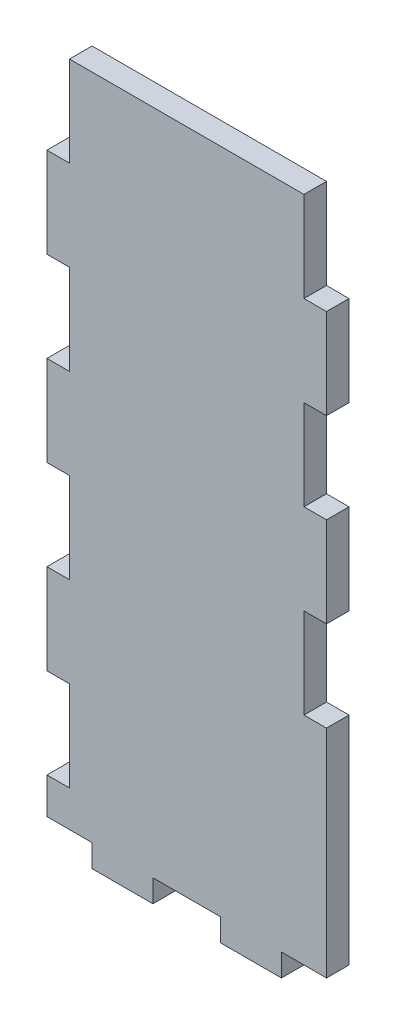
ISO-10303-21;
HEADER;
FILE_DESCRIPTION(('STEP AP214'),'2;1');
FILE_NAME('part.step','',(''),(''),'','','');
FILE_SCHEMA(('AUTOMOTIVE_DESIGN { 1 0 10303 214 1 1 1 1 }'));
ENDSEC;
DATA;
#1=APPLICATION_CONTEXT('core data for automotive mechanical design processes');
#2=APPLICATION_PROTOCOL_DEFINITION('international standard','automotive_design',2000,#1);
#3=PRODUCT_CONTEXT('',#1,'mechanical');
#4=PRODUCT('Part','Part','',(#3));
#5=PRODUCT_RELATED_PRODUCT_CATEGORY('part','',(#4));
#6=PRODUCT_DEFINITION_FORMATION('','',#4);
#7=PRODUCT_DEFINITION_CONTEXT('part definition',#1,'design');
#8=PRODUCT_DEFINITION('design','',#6,#7);
#9=PRODUCT_DEFINITION_SHAPE('','',#8);
#10=(LENGTH_UNIT() NAMED_UNIT(*) SI_UNIT(.MILLI.,.METRE.));
#11=(NAMED_UNIT(*) PLANE_ANGLE_UNIT() SI_UNIT($,.RADIAN.));
#12=(NAMED_UNIT(*) SI_UNIT($,.STERADIAN.) SOLID_ANGLE_UNIT());
#13=UNCERTAINTY_MEASURE_WITH_UNIT(LENGTH_MEASURE(1.E-05),#10,'distance_accuracy_value','');
#14=(GEOMETRIC_REPRESENTATION_CONTEXT(3) GLOBAL_UNCERTAINTY_ASSIGNED_CONTEXT((#13)) GLOBAL_UNIT_ASSIGNED_CONTEXT((#10,
#11,#12)) REPRESENTATION_CONTEXT('',''));
#15=CARTESIAN_POINT('',(0.,0.,0.));
#16=DIRECTION('',(0.,0.,1.));
#17=DIRECTION('',(1.,0.,0.));
#18=AXIS2_PLACEMENT_3D('',#15,#16,#17);
#19=CARTESIAN_POINT('',(33.0200000000001,0.,6.35));
#20=DIRECTION('',(1.,0.,0.));
#21=DIRECTION('',(0.,0.,-1.));
#22=AXIS2_PLACEMENT_3D('',#19,#20,#21);
#23=PLANE('',#22);
#24=DIRECTION('',(0.,-1.,0.));
#25=VECTOR('',#24,1.);
#26=CARTESIAN_POINT('',(33.0200000000001,0.,0.));
#27=LINE('',#26,#25);
#28=CARTESIAN_POINT('',(33.0200000000001,93.98,0.));
#29=VERTEX_POINT('',#28);
#30=CARTESIAN_POINT('',(33.0200000000001,68.58,0.));
#31=VERTEX_POINT('',#30);
#32=EDGE_CURVE('E316',#29,#31,#27,.T.);
#33=ORIENTED_EDGE('',*,*,#32,.F.);
#34=DIRECTION('',(0.,0.,-1.));
#35=VECTOR('',#34,1.);
#36=CARTESIAN_POINT('',(33.0200000000001,93.98,6.35));
#37=LINE('',#36,#35);
#38=CARTESIAN_POINT('',(33.0200000000001,93.98,6.35));
#39=VERTEX_POINT('',#38);
#40=EDGE_CURVE('E11',#39,#29,#37,.T.);
#41=ORIENTED_EDGE('',*,*,#40,.F.);
#42=DIRECTION('',(0.,-1.,0.));
#43=VECTOR('',#42,1.);
#44=CARTESIAN_POINT('',(33.0200000000001,0.,6.35));
#45=LINE('',#44,#43);
#46=CARTESIAN_POINT('',(33.0200000000001,68.58,6.35));
#47=VERTEX_POINT('',#46);
#48=EDGE_CURVE('E425',#39,#47,#45,.T.);
#49=ORIENTED_EDGE('',*,*,#48,.T.);
#50=DIRECTION('',(0.,0.,-1.));
#51=VECTOR('',#50,1.);
#52=CARTESIAN_POINT('',(33.0200000000001,68.58,6.35));
#53=LINE('',#52,#51);
#54=EDGE_CURVE('E67',#47,#31,#53,.T.);
#55=ORIENTED_EDGE('',*,*,#54,.T.);
#56=EDGE_LOOP('',(#33,#41,#49,#55));
#57=FACE_BOUND('',#56,.T.);
#58=ADVANCED_FACE('F49',(#57),#23,.T.);
#59=CARTESIAN_POINT('',(0.,93.98,6.35));
#60=DIRECTION('',(0.,1.,0.));
#61=DIRECTION('',(0.,0.,1.));
#62=AXIS2_PLACEMENT_3D('',#59,#60,#61);
#63=PLANE('',#62);
#64=DIRECTION('',(1.,0.,0.));
#65=VECTOR('',#64,1.);
#66=CARTESIAN_POINT('',(0.,93.98,0.));
#67=LINE('',#66,#65);
#68=CARTESIAN_POINT('',(-33.02,93.98,0.));
#69=VERTEX_POINT('',#68);
#70=EDGE_CURVE('E319',#69,#29,#67,.T.);
#71=ORIENTED_EDGE('',*,*,#70,.F.);
#72=DIRECTION('',(0.,0.,-1.));
#73=VECTOR('',#72,1.);
#74=CARTESIAN_POINT('',(-33.02,93.98,6.35));
#75=LINE('',#74,#73);
#76=CARTESIAN_POINT('',(-33.02,93.98,6.35));
#77=VERTEX_POINT('',#76);
#78=EDGE_CURVE('E59',#77,#69,#75,.T.);
#79=ORIENTED_EDGE('',*,*,#78,.F.);
#80=DIRECTION('',(1.,0.,0.));
#81=VECTOR('',#80,1.);
#82=CARTESIAN_POINT('',(0.,93.98,6.35));
#83=LINE('',#82,#81);
#84=EDGE_CURVE('E547',#77,#39,#83,.T.);
#85=ORIENTED_EDGE('',*,*,#84,.T.);
#86=ORIENTED_EDGE('',*,*,#40,.T.);
#87=EDGE_LOOP('',(#71,#79,#85,#86));
#88=FACE_BOUND('',#87,.T.);
#89=ADVANCED_FACE('F51',(#88),#63,.T.);
#90=CARTESIAN_POINT('',(-33.02,0.,6.35));
#91=DIRECTION('',(1.,0.,0.));
#92=DIRECTION('',(0.,0.,-1.));
#93=AXIS2_PLACEMENT_3D('',#90,#91,#92);
#94=PLANE('',#93);
#95=DIRECTION('',(0.,-1.,0.));
#96=VECTOR('',#95,1.);
#97=CARTESIAN_POINT('',(-33.02,0.,0.));
#98=LINE('',#97,#96);
#99=CARTESIAN_POINT('',(-33.02,68.58,0.));
#100=VERTEX_POINT('',#99);
#101=EDGE_CURVE('E325',#69,#100,#98,.T.);
#102=ORIENTED_EDGE('',*,*,#101,.T.);
#103=DIRECTION('',(0.,0.,-1.));
#104=VECTOR('',#103,1.);
#105=CARTESIAN_POINT('',(-33.02,68.58,6.35));
#106=LINE('',#105,#104);
#107=CARTESIAN_POINT('',(-33.02,68.58,6.35));
#108=VERTEX_POINT('',#107);
#109=EDGE_CURVE('E530',#108,#100,#106,.T.);
#110=ORIENTED_EDGE('',*,*,#109,.F.);
#111=DIRECTION('',(0.,-1.,0.));
#112=VECTOR('',#111,1.);
#113=CARTESIAN_POINT('',(-33.02,0.,6.35));
#114=LINE('',#113,#112);
#115=EDGE_CURVE('E538',#77,#108,#114,.T.);
#116=ORIENTED_EDGE('',*,*,#115,.F.);
#117=ORIENTED_EDGE('',*,*,#78,.T.);
#118=EDGE_LOOP('',(#102,#110,#116,#117));
#119=FACE_BOUND('',#118,.T.);
#120=ADVANCED_FACE('F536',(#119),#94,.F.);
#121=CARTESIAN_POINT('',(0.,68.58,6.35));
#122=DIRECTION('',(0.,1.,0.));
#123=DIRECTION('',(0.,0.,1.));
#124=AXIS2_PLACEMENT_3D('',#121,#122,#123);
#125=PLANE('',#124);
#126=DIRECTION('',(1.,0.,0.));
#127=VECTOR('',#126,1.);
#128=CARTESIAN_POINT('',(0.,68.58,0.));
#129=LINE('',#128,#127);
#130=CARTESIAN_POINT('',(-39.37,68.58,0.));
#131=VERTEX_POINT('',#130);
#132=EDGE_CURVE('E329',#131,#100,#129,.T.);
#133=ORIENTED_EDGE('',*,*,#132,.F.);
#134=DIRECTION('',(0.,0.,-1.));
#135=VECTOR('',#134,1.);
#136=CARTESIAN_POINT('',(-39.37,68.58,6.35));
#137=LINE('',#136,#135);
#138=CARTESIAN_POINT('',(-39.37,68.58,6.35));
#139=VERTEX_POINT('',#138);
#140=EDGE_CURVE('E527',#139,#131,#137,.T.);
#141=ORIENTED_EDGE('',*,*,#140,.F.);
#142=DIRECTION('',(1.,0.,0.));
#143=VECTOR('',#142,1.);
#144=CARTESIAN_POINT('',(0.,68.58,6.35));
#145=LINE('',#144,#143);
#146=EDGE_CURVE('E732',#139,#108,#145,.T.);
#147=ORIENTED_EDGE('',*,*,#146,.T.);
#148=ORIENTED_EDGE('',*,*,#109,.T.);
#149=EDGE_LOOP('',(#133,#141,#147,#148));
#150=FACE_BOUND('',#149,.T.);
#151=ADVANCED_FACE('F747',(#150),#125,.T.);
#152=CARTESIAN_POINT('',(-39.37,0.,6.35));
#153=DIRECTION('',(1.,0.,0.));
#154=DIRECTION('',(0.,0.,-1.));
#155=AXIS2_PLACEMENT_3D('',#152,#153,#154);
#156=PLANE('',#155);
#157=DIRECTION('',(0.,-1.,0.));
#158=VECTOR('',#157,1.);
#159=CARTESIAN_POINT('',(-39.37,0.,0.));
#160=LINE('',#159,#158);
#161=CARTESIAN_POINT('',(-39.37,43.18,0.));
#162=VERTEX_POINT('',#161);
#163=EDGE_CURVE('E335',#131,#162,#160,.T.);
#164=ORIENTED_EDGE('',*,*,#163,.T.);
#165=DIRECTION('',(0.,0.,-1.));
#166=VECTOR('',#165,1.);
#167=CARTESIAN_POINT('',(-39.37,43.18,6.35));
#168=LINE('',#167,#166);
#169=CARTESIAN_POINT('',(-39.37,43.18,6.35));
#170=VERTEX_POINT('',#169);
#171=EDGE_CURVE('E523',#170,#162,#168,.T.);
#172=ORIENTED_EDGE('',*,*,#171,.F.);
#173=DIRECTION('',(0.,-1.,0.));
#174=VECTOR('',#173,1.);
#175=CARTESIAN_POINT('',(-39.37,0.,6.35));
#176=LINE('',#175,#174);
#177=EDGE_CURVE('E736',#139,#170,#176,.T.);
#178=ORIENTED_EDGE('',*,*,#177,.F.);
#179=ORIENTED_EDGE('',*,*,#140,.T.);
#180=EDGE_LOOP('',(#164,#172,#178,#179));
#181=FACE_BOUND('',#180,.T.);
#182=ADVANCED_FACE('F748',(#181),#156,.F.);
#183=CARTESIAN_POINT('',(0.,43.18,6.35));
#184=DIRECTION('',(0.,1.,0.));
#185=DIRECTION('',(0.,0.,1.));
#186=AXIS2_PLACEMENT_3D('',#183,#184,#185);
#187=PLANE('',#186);
#188=DIRECTION('',(1.,0.,0.));
#189=VECTOR('',#188,1.);
#190=CARTESIAN_POINT('',(0.,43.18,0.));
#191=LINE('',#190,#189);
#192=CARTESIAN_POINT('',(-33.02,43.18,0.));
#193=VERTEX_POINT('',#192);
#194=EDGE_CURVE('E338',#162,#193,#191,.T.);
#195=ORIENTED_EDGE('',*,*,#194,.T.);
#196=DIRECTION('',(0.,0.,-1.));
#197=VECTOR('',#196,1.);
#198=CARTESIAN_POINT('',(-33.02,43.18,6.35));
#199=LINE('',#198,#197);
#200=CARTESIAN_POINT('',(-33.02,43.18,6.35));
#201=VERTEX_POINT('',#200);
#202=EDGE_CURVE('E519',#201,#193,#199,.T.);
#203=ORIENTED_EDGE('',*,*,#202,.F.);
#204=DIRECTION('',(1.,0.,0.));
#205=VECTOR('',#204,1.);
#206=CARTESIAN_POINT('',(0.,43.18,6.35));
#207=LINE('',#206,#205);
#208=EDGE_CURVE('E664',#170,#201,#207,.T.);
#209=ORIENTED_EDGE('',*,*,#208,.F.);
#210=ORIENTED_EDGE('',*,*,#171,.T.);
#211=EDGE_LOOP('',(#195,#203,#209,#210));
#212=FACE_BOUND('',#211,.T.);
#213=ADVANCED_FACE('F744',(#212),#187,.F.);
#214=CARTESIAN_POINT('',(-33.02,17.78,0.));
#215=VERTEX_POINT('',#214);
#216=EDGE_CURVE('E331',#193,#215,#98,.T.);
#217=ORIENTED_EDGE('',*,*,#216,.T.);
#218=DIRECTION('',(0.,0.,-1.));
#219=VECTOR('',#218,1.);
#220=CARTESIAN_POINT('',(-33.02,17.78,6.35));
#221=LINE('',#220,#219);
#222=CARTESIAN_POINT('',(-33.02,17.78,6.35));
#223=VERTEX_POINT('',#222);
#224=EDGE_CURVE('E516',#223,#215,#221,.T.);
#225=ORIENTED_EDGE('',*,*,#224,.F.);
#226=EDGE_CURVE('E658',#201,#223,#114,.T.);
#227=ORIENTED_EDGE('',*,*,#226,.F.);
#228=ORIENTED_EDGE('',*,*,#202,.T.);
#229=EDGE_LOOP('',(#217,#225,#227,#228));
#230=FACE_BOUND('',#229,.T.);
#231=ADVANCED_FACE('F643',(#230),#94,.F.);
#232=CARTESIAN_POINT('',(0.,17.78,6.35));
#233=DIRECTION('',(0.,1.,0.));
#234=DIRECTION('',(0.,0.,1.));
#235=AXIS2_PLACEMENT_3D('',#232,#233,#234);
#236=PLANE('',#235);
#237=DIRECTION('',(1.,0.,0.));
#238=VECTOR('',#237,1.);
#239=CARTESIAN_POINT('',(0.,17.78,0.));
#240=LINE('',#239,#238);
#241=CARTESIAN_POINT('',(-39.37,17.78,0.));
#242=VERTEX_POINT('',#241);
#243=EDGE_CURVE('E341',#242,#215,#240,.T.);
#244=ORIENTED_EDGE('',*,*,#243,.F.);
#245=DIRECTION('',(0.,0.,-1.));
#246=VECTOR('',#245,1.);
#247=CARTESIAN_POINT('',(-39.37,17.78,6.35));
#248=LINE('',#247,#246);
#249=CARTESIAN_POINT('',(-39.37,17.78,6.35));
#250=VERTEX_POINT('',#249);
#251=EDGE_CURVE('E513',#250,#242,#248,.T.);
#252=ORIENTED_EDGE('',*,*,#251,.F.);
#253=DIRECTION('',(1.,0.,0.));
#254=VECTOR('',#253,1.);
#255=CARTESIAN_POINT('',(0.,17.78,6.35));
#256=LINE('',#255,#254);
#257=EDGE_CURVE('E655',#250,#223,#256,.T.);
#258=ORIENTED_EDGE('',*,*,#257,.T.);
#259=ORIENTED_EDGE('',*,*,#224,.T.);
#260=EDGE_LOOP('',(#244,#252,#258,#259));
#261=FACE_BOUND('',#260,.T.);
#262=ADVANCED_FACE('F652',(#261),#236,.T.);
#263=CARTESIAN_POINT('',(-39.37,0.,6.35));
#264=DIRECTION('',(1.,0.,0.));
#265=DIRECTION('',(0.,0.,-1.));
#266=AXIS2_PLACEMENT_3D('',#263,#264,#265);
#267=PLANE('',#266);
#268=DIRECTION('',(0.,-1.,0.));
#269=VECTOR('',#268,1.);
#270=CARTESIAN_POINT('',(-39.37,0.,0.));
#271=LINE('',#270,#269);
#272=CARTESIAN_POINT('',(-39.37,-7.61999999999999,0.));
#273=VERTEX_POINT('',#272);
#274=EDGE_CURVE('E345',#242,#273,#271,.T.);
#275=ORIENTED_EDGE('',*,*,#274,.T.);
#276=DIRECTION('',(0.,0.,-1.));
#277=VECTOR('',#276,1.);
#278=CARTESIAN_POINT('',(-39.37,-7.61999999999999,6.35));
#279=LINE('',#278,#277);
#280=CARTESIAN_POINT('',(-39.37,-7.61999999999999,6.35));
#281=VERTEX_POINT('',#280);
#282=EDGE_CURVE('E509',#281,#273,#279,.T.);
#283=ORIENTED_EDGE('',*,*,#282,.F.);
#284=DIRECTION('',(0.,-1.,0.));
#285=VECTOR('',#284,1.);
#286=CARTESIAN_POINT('',(-39.37,0.,6.35));
#287=LINE('',#286,#285);
#288=EDGE_CURVE('E657',#250,#281,#287,.T.);
#289=ORIENTED_EDGE('',*,*,#288,.F.);
#290=ORIENTED_EDGE('',*,*,#251,.T.);
#291=EDGE_LOOP('',(#275,#283,#289,#290));
#292=FACE_BOUND('',#291,.T.);
#293=ADVANCED_FACE('F759',(#292),#267,.F.);
#294=CARTESIAN_POINT('',(0.,-7.61999999999999,6.35));
#295=DIRECTION('',(0.,1.,0.));
#296=DIRECTION('',(0.,0.,1.));
#297=AXIS2_PLACEMENT_3D('',#294,#295,#296);
#298=PLANE('',#297);
#299=DIRECTION('',(1.,0.,0.));
#300=VECTOR('',#299,1.);
#301=CARTESIAN_POINT('',(0.,-7.61999999999999,0.));
#302=LINE('',#301,#300);
#303=CARTESIAN_POINT('',(-33.02,-7.61999999999999,0.));
#304=VERTEX_POINT('',#303);
#305=EDGE_CURVE('E348',#273,#304,#302,.T.);
#306=ORIENTED_EDGE('',*,*,#305,.T.);
#307=DIRECTION('',(0.,0.,-1.));
#308=VECTOR('',#307,1.);
#309=CARTESIAN_POINT('',(-33.02,-7.61999999999999,6.35));
#310=LINE('',#309,#308);
#311=CARTESIAN_POINT('',(-33.02,-7.61999999999999,6.35));
#312=VERTEX_POINT('',#311);
#313=EDGE_CURVE('E505',#312,#304,#310,.T.);
#314=ORIENTED_EDGE('',*,*,#313,.F.);
#315=DIRECTION('',(1.,0.,0.));
#316=VECTOR('',#315,1.);
#317=CARTESIAN_POINT('',(0.,-7.61999999999999,6.35));
#318=LINE('',#317,#316);
#319=EDGE_CURVE('E662',#281,#312,#318,.T.);
#320=ORIENTED_EDGE('',*,*,#319,.F.);
#321=ORIENTED_EDGE('',*,*,#282,.T.);
#322=EDGE_LOOP('',(#306,#314,#320,#321));
#323=FACE_BOUND('',#322,.T.);
#324=ADVANCED_FACE('F762',(#323),#298,.F.);
#325=CARTESIAN_POINT('',(-33.02,-33.02,0.));
#326=VERTEX_POINT('',#325);
#327=EDGE_CURVE('E351',#304,#326,#98,.T.);
#328=ORIENTED_EDGE('',*,*,#327,.T.);
#329=DIRECTION('',(0.,0.,-1.));
#330=VECTOR('',#329,1.);
#331=CARTESIAN_POINT('',(-33.02,-33.02,6.35));
#332=LINE('',#331,#330);
#333=CARTESIAN_POINT('',(-33.02,-33.02,6.35));
#334=VERTEX_POINT('',#333);
#335=EDGE_CURVE('E502',#334,#326,#332,.T.);
#336=ORIENTED_EDGE('',*,*,#335,.F.);
#337=EDGE_CURVE('E666',#312,#334,#114,.T.);
#338=ORIENTED_EDGE('',*,*,#337,.F.);
#339=ORIENTED_EDGE('',*,*,#313,.T.);
#340=EDGE_LOOP('',(#328,#336,#338,#339));
#341=FACE_BOUND('',#340,.T.);
#342=ADVANCED_FACE('F766',(#341),#94,.F.);
#343=CARTESIAN_POINT('',(0.,-33.02,6.35));
#344=DIRECTION('',(0.,1.,0.));
#345=DIRECTION('',(0.,0.,1.));
#346=AXIS2_PLACEMENT_3D('',#343,#344,#345);
#347=PLANE('',#346);
#348=DIRECTION('',(1.,0.,0.));
#349=VECTOR('',#348,1.);
#350=CARTESIAN_POINT('',(0.,-33.02,0.));
#351=LINE('',#350,#349);
#352=CARTESIAN_POINT('',(-39.37,-33.02,0.));
#353=VERTEX_POINT('',#352);
#354=EDGE_CURVE('E352',#353,#326,#351,.T.);
#355=ORIENTED_EDGE('',*,*,#354,.F.);
#356=DIRECTION('',(0.,0.,-1.));
#357=VECTOR('',#356,1.);
#358=CARTESIAN_POINT('',(-39.37,-33.02,6.35));
#359=LINE('',#358,#357);
#360=CARTESIAN_POINT('',(-39.37,-33.02,6.35));
#361=VERTEX_POINT('',#360);
#362=EDGE_CURVE('E499',#361,#353,#359,.T.);
#363=ORIENTED_EDGE('',*,*,#362,.F.);
#364=DIRECTION('',(1.,0.,0.));
#365=VECTOR('',#364,1.);
#366=CARTESIAN_POINT('',(0.,-33.02,6.35));
#367=LINE('',#366,#365);
#368=EDGE_CURVE('E672',#361,#334,#367,.T.);
#369=ORIENTED_EDGE('',*,*,#368,.T.);
#370=ORIENTED_EDGE('',*,*,#335,.T.);
#371=EDGE_LOOP('',(#355,#363,#369,#370));
#372=FACE_BOUND('',#371,.T.);
#373=ADVANCED_FACE('F768',(#372),#347,.T.);
#374=CARTESIAN_POINT('',(-39.37,0.,6.35));
#375=DIRECTION('',(1.,0.,0.));
#376=DIRECTION('',(0.,0.,-1.));
#377=AXIS2_PLACEMENT_3D('',#374,#375,#376);
#378=PLANE('',#377);
#379=DIRECTION('',(0.,-1.,0.));
#380=VECTOR('',#379,1.);
#381=CARTESIAN_POINT('',(-39.37,0.,0.));
#382=LINE('',#381,#380);
#383=CARTESIAN_POINT('',(-39.37,-58.42,0.));
#384=VERTEX_POINT('',#383);
#385=EDGE_CURVE('E356',#353,#384,#382,.T.);
#386=ORIENTED_EDGE('',*,*,#385,.T.);
#387=DIRECTION('',(0.,0.,-1.));
#388=VECTOR('',#387,1.);
#389=CARTESIAN_POINT('',(-39.37,-58.42,6.35));
#390=LINE('',#389,#388);
#391=CARTESIAN_POINT('',(-39.37,-58.42,6.35));
#392=VERTEX_POINT('',#391);
#393=EDGE_CURVE('E495',#392,#384,#390,.T.);
#394=ORIENTED_EDGE('',*,*,#393,.F.);
#395=DIRECTION('',(0.,-1.,0.));
#396=VECTOR('',#395,1.);
#397=CARTESIAN_POINT('',(-39.37,0.,6.35));
#398=LINE('',#397,#396);
#399=EDGE_CURVE('E676',#361,#392,#398,.T.);
#400=ORIENTED_EDGE('',*,*,#399,.F.);
#401=ORIENTED_EDGE('',*,*,#362,.T.);
#402=EDGE_LOOP('',(#386,#394,#400,#401));
#403=FACE_BOUND('',#402,.T.);
#404=ADVANCED_FACE('F771',(#403),#378,.F.);
#405=CARTESIAN_POINT('',(0.,-58.42,6.35));
#406=DIRECTION('',(0.,1.,0.));
#407=DIRECTION('',(0.,0.,1.));
#408=AXIS2_PLACEMENT_3D('',#405,#406,#407);
#409=PLANE('',#408);
#410=DIRECTION('',(1.,0.,0.));
#411=VECTOR('',#410,1.);
#412=CARTESIAN_POINT('',(0.,-58.42,0.));
#413=LINE('',#412,#411);
#414=CARTESIAN_POINT('',(-33.02,-58.42,0.));
#415=VERTEX_POINT('',#414);
#416=EDGE_CURVE('E359',#384,#415,#413,.T.);
#417=ORIENTED_EDGE('',*,*,#416,.T.);
#418=DIRECTION('',(0.,0.,-1.));
#419=VECTOR('',#418,1.);
#420=CARTESIAN_POINT('',(-33.02,-58.42,6.35));
#421=LINE('',#420,#419);
#422=CARTESIAN_POINT('',(-33.02,-58.42,6.35));
#423=VERTEX_POINT('',#422);
#424=EDGE_CURVE('E491',#423,#415,#421,.T.);
#425=ORIENTED_EDGE('',*,*,#424,.F.);
#426=DIRECTION('',(1.,0.,0.));
#427=VECTOR('',#426,1.);
#428=CARTESIAN_POINT('',(0.,-58.42,6.35));
#429=LINE('',#428,#427);
#430=EDGE_CURVE('E679',#392,#423,#429,.T.);
#431=ORIENTED_EDGE('',*,*,#430,.F.);
#432=ORIENTED_EDGE('',*,*,#393,.T.);
#433=EDGE_LOOP('',(#417,#425,#431,#432));
#434=FACE_BOUND('',#433,.T.);
#435=ADVANCED_FACE('F775',(#434),#409,.F.);
#436=CARTESIAN_POINT('',(-33.02,-83.82,0.));
#437=VERTEX_POINT('',#436);
#438=EDGE_CURVE('E330',#415,#437,#98,.T.);
#439=ORIENTED_EDGE('',*,*,#438,.T.);
#440=DIRECTION('',(0.,0.,-1.));
#441=VECTOR('',#440,1.);
#442=CARTESIAN_POINT('',(-33.02,-83.82,6.35));
#443=LINE('',#442,#441);
#444=CARTESIAN_POINT('',(-33.02,-83.82,6.35));
#445=VERTEX_POINT('',#444);
#446=EDGE_CURVE('E488',#445,#437,#443,.T.);
#447=ORIENTED_EDGE('',*,*,#446,.F.);
#448=EDGE_CURVE('E682',#423,#445,#114,.T.);
#449=ORIENTED_EDGE('',*,*,#448,.F.);
#450=ORIENTED_EDGE('',*,*,#424,.T.);
#451=EDGE_LOOP('',(#439,#447,#449,#450));
#452=FACE_BOUND('',#451,.T.);
#453=ADVANCED_FACE('F779',(#452),#94,.F.);
#454=CARTESIAN_POINT('',(0.,-83.82,6.35));
#455=DIRECTION('',(0.,1.,0.));
#456=DIRECTION('',(0.,0.,1.));
#457=AXIS2_PLACEMENT_3D('',#454,#455,#456);
#458=PLANE('',#457);
#459=DIRECTION('',(1.,0.,0.));
#460=VECTOR('',#459,1.);
#461=CARTESIAN_POINT('',(0.,-83.82,0.));
#462=LINE('',#461,#460);
#463=CARTESIAN_POINT('',(-39.37,-83.82,0.));
#464=VERTEX_POINT('',#463);
#465=EDGE_CURVE('E362',#464,#437,#462,.T.);
#466=ORIENTED_EDGE('',*,*,#465,.F.);
#467=DIRECTION('',(0.,0.,-1.));
#468=VECTOR('',#467,1.);
#469=CARTESIAN_POINT('',(-39.37,-83.82,6.35));
#470=LINE('',#469,#468);
#471=CARTESIAN_POINT('',(-39.37,-83.82,6.35));
#472=VERTEX_POINT('',#471);
#473=EDGE_CURVE('E485',#472,#464,#470,.T.);
#474=ORIENTED_EDGE('',*,*,#473,.F.);
#475=DIRECTION('',(1.,0.,0.));
#476=VECTOR('',#475,1.);
#477=CARTESIAN_POINT('',(0.,-83.82,6.35));
#478=LINE('',#477,#476);
#479=EDGE_CURVE('E683',#472,#445,#478,.T.);
#480=ORIENTED_EDGE('',*,*,#479,.T.);
#481=ORIENTED_EDGE('',*,*,#446,.T.);
#482=EDGE_LOOP('',(#466,#474,#480,#481));
#483=FACE_BOUND('',#482,.T.);
#484=ADVANCED_FACE('F783',(#483),#458,.T.);
#485=CARTESIAN_POINT('',(-39.37,0.,6.35));
#486=DIRECTION('',(1.,0.,0.));
#487=DIRECTION('',(0.,0.,-1.));
#488=AXIS2_PLACEMENT_3D('',#485,#486,#487);
#489=PLANE('',#488);
#490=DIRECTION('',(0.,-1.,0.));
#491=VECTOR('',#490,1.);
#492=CARTESIAN_POINT('',(-39.37,0.,0.));
#493=LINE('',#492,#491);
#494=CARTESIAN_POINT('',(-39.37,-93.98,0.));
#495=VERTEX_POINT('',#494);
#496=EDGE_CURVE('E366',#464,#495,#493,.T.);
#497=ORIENTED_EDGE('',*,*,#496,.T.);
#498=DIRECTION('',(0.,0.,-1.));
#499=VECTOR('',#498,1.);
#500=CARTESIAN_POINT('',(-39.37,-93.98,6.35));
#501=LINE('',#500,#499);
#502=CARTESIAN_POINT('',(-39.37,-93.98,6.35));
#503=VERTEX_POINT('',#502);
#504=EDGE_CURVE('E481',#503,#495,#501,.T.);
#505=ORIENTED_EDGE('',*,*,#504,.F.);
#506=DIRECTION('',(0.,-1.,0.));
#507=VECTOR('',#506,1.);
#508=CARTESIAN_POINT('',(-39.37,0.,6.35));
#509=LINE('',#508,#507);
#510=EDGE_CURVE('E687',#472,#503,#509,.T.);
#511=ORIENTED_EDGE('',*,*,#510,.F.);
#512=ORIENTED_EDGE('',*,*,#473,.T.);
#513=EDGE_LOOP('',(#497,#505,#511,#512));
#514=FACE_BOUND('',#513,.T.);
#515=ADVANCED_FACE('F787',(#514),#489,.F.);
#516=CARTESIAN_POINT('',(0.,-93.98,6.35));
#517=DIRECTION('',(0.,1.,0.));
#518=DIRECTION('',(0.,0.,1.));
#519=AXIS2_PLACEMENT_3D('',#516,#517,#518);
#520=PLANE('',#519);
#521=DIRECTION('',(1.,0.,0.));
#522=VECTOR('',#521,1.);
#523=CARTESIAN_POINT('',(0.,-93.98,0.));
#524=LINE('',#523,#522);
#525=CARTESIAN_POINT('',(-26.67,-93.98,0.));
#526=VERTEX_POINT('',#525);
#527=EDGE_CURVE('E369',#495,#526,#524,.T.);
#528=ORIENTED_EDGE('',*,*,#527,.T.);
#529=DIRECTION('',(0.,0.,-1.));
#530=VECTOR('',#529,1.);
#531=CARTESIAN_POINT('',(-26.67,-93.98,6.35));
#532=LINE('',#531,#530);
#533=CARTESIAN_POINT('',(-26.67,-93.98,6.35));
#534=VERTEX_POINT('',#533);
#535=EDGE_CURVE('E477',#534,#526,#532,.T.);
#536=ORIENTED_EDGE('',*,*,#535,.F.);
#537=DIRECTION('',(1.,0.,0.));
#538=VECTOR('',#537,1.);
#539=CARTESIAN_POINT('',(0.,-93.98,6.35));
#540=LINE('',#539,#538);
#541=EDGE_CURVE('E690',#503,#534,#540,.T.);
#542=ORIENTED_EDGE('',*,*,#541,.F.);
#543=ORIENTED_EDGE('',*,*,#504,.T.);
#544=EDGE_LOOP('',(#528,#536,#542,#543));
#545=FACE_BOUND('',#544,.T.);
#546=ADVANCED_FACE('F791',(#545),#520,.F.);
#547=CARTESIAN_POINT('',(-26.67,0.,6.35));
#548=DIRECTION('',(1.,0.,0.));
#549=DIRECTION('',(0.,0.,-1.));
#550=AXIS2_PLACEMENT_3D('',#547,#548,#549);
#551=PLANE('',#550);
#552=DIRECTION('',(0.,-1.,0.));
#553=VECTOR('',#552,1.);
#554=CARTESIAN_POINT('',(-26.67,0.,0.));
#555=LINE('',#554,#553);
#556=CARTESIAN_POINT('',(-26.67,-100.33,0.));
#557=VERTEX_POINT('',#556);
#558=EDGE_CURVE('E372',#526,#557,#555,.T.);
#559=ORIENTED_EDGE('',*,*,#558,.T.);
#560=DIRECTION('',(0.,0.,-1.));
#561=VECTOR('',#560,1.);
#562=CARTESIAN_POINT('',(-26.67,-100.33,6.35));
#563=LINE('',#562,#561);
#564=CARTESIAN_POINT('',(-26.67,-100.33,6.35));
#565=VERTEX_POINT('',#564);
#566=EDGE_CURVE('E473',#565,#557,#563,.T.);
#567=ORIENTED_EDGE('',*,*,#566,.F.);
#568=DIRECTION('',(0.,-1.,0.));
#569=VECTOR('',#568,1.);
#570=CARTESIAN_POINT('',(-26.67,0.,6.35));
#571=LINE('',#570,#569);
#572=EDGE_CURVE('E693',#534,#565,#571,.T.);
#573=ORIENTED_EDGE('',*,*,#572,.F.);
#574=ORIENTED_EDGE('',*,*,#535,.T.);
#575=EDGE_LOOP('',(#559,#567,#573,#574));
#576=FACE_BOUND('',#575,.T.);
#577=ADVANCED_FACE('F793',(#576),#551,.F.);
#578=CARTESIAN_POINT('',(0.,-100.33,6.35));
#579=DIRECTION('',(0.,1.,0.));
#580=DIRECTION('',(0.,0.,1.));
#581=AXIS2_PLACEMENT_3D('',#578,#579,#580);
#582=PLANE('',#581);
#583=DIRECTION('',(1.,0.,0.));
#584=VECTOR('',#583,1.);
#585=CARTESIAN_POINT('',(0.,-100.33,0.));
#586=LINE('',#585,#584);
#587=CARTESIAN_POINT('',(-9.525,-100.33,0.));
#588=VERTEX_POINT('',#587);
#589=EDGE_CURVE('E377',#557,#588,#586,.T.);
#590=ORIENTED_EDGE('',*,*,#589,.T.);
#591=DIRECTION('',(0.,0.,-1.));
#592=VECTOR('',#591,1.);
#593=CARTESIAN_POINT('',(-9.525,-100.33,6.35));
#594=LINE('',#593,#592);
#595=CARTESIAN_POINT('',(-9.525,-100.33,6.35));
#596=VERTEX_POINT('',#595);
#597=EDGE_CURVE('E470',#596,#588,#594,.T.);
#598=ORIENTED_EDGE('',*,*,#597,.F.);
#599=DIRECTION('',(1.,0.,0.));
#600=VECTOR('',#599,1.);
#601=CARTESIAN_POINT('',(0.,-100.33,6.35));
#602=LINE('',#601,#600);
#603=EDGE_CURVE('E697',#565,#596,#602,.T.);
#604=ORIENTED_EDGE('',*,*,#603,.F.);
#605=ORIENTED_EDGE('',*,*,#566,.T.);
#606=EDGE_LOOP('',(#590,#598,#604,#605));
#607=FACE_BOUND('',#606,.T.);
#608=ADVANCED_FACE('F796',(#607),#582,.F.);
#609=CARTESIAN_POINT('',(-9.525,0.,6.35));
#610=DIRECTION('',(1.,0.,0.));
#611=DIRECTION('',(0.,0.,-1.));
#612=AXIS2_PLACEMENT_3D('',#609,#610,#611);
#613=PLANE('',#612);
#614=DIRECTION('',(0.,-1.,0.));
#615=VECTOR('',#614,1.);
#616=CARTESIAN_POINT('',(-9.525,0.,0.));
#617=LINE('',#616,#615);
#618=CARTESIAN_POINT('',(-9.525,-93.98,0.));
#619=VERTEX_POINT('',#618);
#620=EDGE_CURVE('E381',#619,#588,#617,.T.);
#621=ORIENTED_EDGE('',*,*,#620,.F.);
#622=DIRECTION('',(0.,0.,-1.));
#623=VECTOR('',#622,1.);
#624=CARTESIAN_POINT('',(-9.525,-93.98,6.35));
#625=LINE('',#624,#623);
#626=CARTESIAN_POINT('',(-9.525,-93.98,6.35));
#627=VERTEX_POINT('',#626);
#628=EDGE_CURVE('E467',#627,#619,#625,.T.);
#629=ORIENTED_EDGE('',*,*,#628,.F.);
#630=DIRECTION('',(0.,-1.,0.));
#631=VECTOR('',#630,1.);
#632=CARTESIAN_POINT('',(-9.525,0.,6.35));
#633=LINE('',#632,#631);
#634=EDGE_CURVE('E700',#627,#596,#633,.T.);
#635=ORIENTED_EDGE('',*,*,#634,.T.);
#636=ORIENTED_EDGE('',*,*,#597,.T.);
#637=EDGE_LOOP('',(#621,#629,#635,#636));
#638=FACE_BOUND('',#637,.T.);
#639=ADVANCED_FACE('F800',(#638),#613,.T.);
#640=CARTESIAN_POINT('',(9.525,-93.98,0.));
#641=VERTEX_POINT('',#640);
#642=EDGE_CURVE('E374',#619,#641,#524,.T.);
#643=ORIENTED_EDGE('',*,*,#642,.T.);
#644=DIRECTION('',(0.,0.,-1.));
#645=VECTOR('',#644,1.);
#646=CARTESIAN_POINT('',(9.525,-93.98,6.35));
#647=LINE('',#646,#645);
#648=CARTESIAN_POINT('',(9.525,-93.98,6.35));
#649=VERTEX_POINT('',#648);
#650=EDGE_CURVE('E463',#649,#641,#647,.T.);
#651=ORIENTED_EDGE('',*,*,#650,.F.);
#652=EDGE_CURVE('E631',#627,#649,#540,.T.);
#653=ORIENTED_EDGE('',*,*,#652,.F.);
#654=ORIENTED_EDGE('',*,*,#628,.T.);
#655=EDGE_LOOP('',(#643,#651,#653,#654));
#656=FACE_BOUND('',#655,.T.);
#657=ADVANCED_FACE('F630',(#656),#520,.F.);
#658=CARTESIAN_POINT('',(9.525,0.,6.35));
#659=DIRECTION('',(1.,0.,0.));
#660=DIRECTION('',(0.,0.,-1.));
#661=AXIS2_PLACEMENT_3D('',#658,#659,#660);
#662=PLANE('',#661);
#663=DIRECTION('',(0.,-1.,0.));
#664=VECTOR('',#663,1.);
#665=CARTESIAN_POINT('',(9.525,0.,0.));
#666=LINE('',#665,#664);
#667=CARTESIAN_POINT('',(9.525,-100.33,0.));
#668=VERTEX_POINT('',#667);
#669=EDGE_CURVE('E385',#641,#668,#666,.T.);
#670=ORIENTED_EDGE('',*,*,#669,.T.);
#671=DIRECTION('',(0.,0.,-1.));
#672=VECTOR('',#671,1.);
#673=CARTESIAN_POINT('',(9.525,-100.33,6.35));
#674=LINE('',#673,#672);
#675=CARTESIAN_POINT('',(9.525,-100.33,6.35));
#676=VERTEX_POINT('',#675);
#677=EDGE_CURVE('E459',#676,#668,#674,.T.);
#678=ORIENTED_EDGE('',*,*,#677,.F.);
#679=DIRECTION('',(0.,-1.,0.));
#680=VECTOR('',#679,1.);
#681=CARTESIAN_POINT('',(9.525,0.,6.35));
#682=LINE('',#681,#680);
#683=EDGE_CURVE('E627',#649,#676,#682,.T.);
#684=ORIENTED_EDGE('',*,*,#683,.F.);
#685=ORIENTED_EDGE('',*,*,#650,.T.);
#686=EDGE_LOOP('',(#670,#678,#684,#685));
#687=FACE_BOUND('',#686,.T.);
#688=ADVANCED_FACE('F624',(#687),#662,.F.);
#689=CARTESIAN_POINT('',(0.,-100.33,6.35));
#690=DIRECTION('',(0.,1.,0.));
#691=DIRECTION('',(0.,0.,1.));
#692=AXIS2_PLACEMENT_3D('',#689,#690,#691);
#693=PLANE('',#692);
#694=DIRECTION('',(1.,0.,0.));
#695=VECTOR('',#694,1.);
#696=CARTESIAN_POINT('',(0.,-100.33,0.));
#697=LINE('',#696,#695);
#698=CARTESIAN_POINT('',(26.67,-100.33,0.));
#699=VERTEX_POINT('',#698);
#700=EDGE_CURVE('E388',#668,#699,#697,.T.);
#701=ORIENTED_EDGE('',*,*,#700,.T.);
#702=DIRECTION('',(0.,0.,-1.));
#703=VECTOR('',#702,1.);
#704=CARTESIAN_POINT('',(26.67,-100.33,6.35));
#705=LINE('',#704,#703);
#706=CARTESIAN_POINT('',(26.67,-100.33,6.35));
#707=VERTEX_POINT('',#706);
#708=EDGE_CURVE('E456',#707,#699,#705,.T.);
#709=ORIENTED_EDGE('',*,*,#708,.F.);
#710=DIRECTION('',(1.,0.,0.));
#711=VECTOR('',#710,1.);
#712=CARTESIAN_POINT('',(0.,-100.33,6.35));
#713=LINE('',#712,#711);
#714=EDGE_CURVE('E706',#676,#707,#713,.T.);
#715=ORIENTED_EDGE('',*,*,#714,.F.);
#716=ORIENTED_EDGE('',*,*,#677,.T.);
#717=EDGE_LOOP('',(#701,#709,#715,#716));
#718=FACE_BOUND('',#717,.T.);
#719=ADVANCED_FACE('F618',(#718),#693,.F.);
#720=CARTESIAN_POINT('',(26.67,0.,6.35));
#721=DIRECTION('',(1.,0.,0.));
#722=DIRECTION('',(0.,0.,-1.));
#723=AXIS2_PLACEMENT_3D('',#720,#721,#722);
#724=PLANE('',#723);
#725=DIRECTION('',(0.,-1.,0.));
#726=VECTOR('',#725,1.);
#727=CARTESIAN_POINT('',(26.67,0.,0.));
#728=LINE('',#727,#726);
#729=CARTESIAN_POINT('',(26.67,-93.98,0.));
#730=VERTEX_POINT('',#729);
#731=EDGE_CURVE('E392',#730,#699,#728,.T.);
#732=ORIENTED_EDGE('',*,*,#731,.F.);
#733=DIRECTION('',(0.,0.,-1.));
#734=VECTOR('',#733,1.);
#735=CARTESIAN_POINT('',(26.67,-93.98,6.35));
#736=LINE('',#735,#734);
#737=CARTESIAN_POINT('',(26.67,-93.98,6.35));
#738=VERTEX_POINT('',#737);
#739=EDGE_CURVE('E453',#738,#730,#736,.T.);
#740=ORIENTED_EDGE('',*,*,#739,.F.);
#741=DIRECTION('',(0.,-1.,0.));
#742=VECTOR('',#741,1.);
#743=CARTESIAN_POINT('',(26.67,0.,6.35));
#744=LINE('',#743,#742);
#745=EDGE_CURVE('E615',#738,#707,#744,.T.);
#746=ORIENTED_EDGE('',*,*,#745,.T.);
#747=ORIENTED_EDGE('',*,*,#708,.T.);
#748=EDGE_LOOP('',(#732,#740,#746,#747));
#749=FACE_BOUND('',#748,.T.);
#750=ADVANCED_FACE('F610',(#749),#724,.T.);
#751=CARTESIAN_POINT('',(39.37,-93.98,0.));
#752=VERTEX_POINT('',#751);
#753=EDGE_CURVE('E373',#730,#752,#524,.T.);
#754=ORIENTED_EDGE('',*,*,#753,.T.);
#755=DIRECTION('',(0.,0.,-1.));
#756=VECTOR('',#755,1.);
#757=CARTESIAN_POINT('',(39.37,-93.98,6.35));
#758=LINE('',#757,#756);
#759=CARTESIAN_POINT('',(39.37,-93.98,6.35));
#760=VERTEX_POINT('',#759);
#761=EDGE_CURVE('E450',#760,#752,#758,.T.);
#762=ORIENTED_EDGE('',*,*,#761,.F.);
#763=EDGE_CURVE('E694',#738,#760,#540,.T.);
#764=ORIENTED_EDGE('',*,*,#763,.F.);
#765=ORIENTED_EDGE('',*,*,#739,.T.);
#766=EDGE_LOOP('',(#754,#762,#764,#765));
#767=FACE_BOUND('',#766,.T.);
#768=ADVANCED_FACE('F811',(#767),#520,.F.);
#769=CARTESIAN_POINT('',(39.37,0.,6.35));
#770=DIRECTION('',(1.,0.,0.));
#771=DIRECTION('',(0.,0.,-1.));
#772=AXIS2_PLACEMENT_3D('',#769,#770,#771);
#773=PLANE('',#772);
#774=DIRECTION('',(0.,-1.,0.));
#775=VECTOR('',#774,1.);
#776=CARTESIAN_POINT('',(39.37,0.,0.));
#777=LINE('',#776,#775);
#778=CARTESIAN_POINT('',(39.37,-33.02,0.));
#779=VERTEX_POINT('',#778);
#780=EDGE_CURVE('E396',#779,#752,#777,.T.);
#781=ORIENTED_EDGE('',*,*,#780,.F.);
#782=DIRECTION('',(0.,0.,-1.));
#783=VECTOR('',#782,1.);
#784=CARTESIAN_POINT('',(39.37,-33.02,6.35));
#785=LINE('',#784,#783);
#786=CARTESIAN_POINT('',(39.37,-33.02,6.35));
#787=VERTEX_POINT('',#786);
#788=EDGE_CURVE('E447',#787,#779,#785,.T.);
#789=ORIENTED_EDGE('',*,*,#788,.F.);
#790=DIRECTION('',(0.,-1.,0.));
#791=VECTOR('',#790,1.);
#792=CARTESIAN_POINT('',(39.37,0.,6.35));
#793=LINE('',#792,#791);
#794=EDGE_CURVE('E711',#787,#760,#793,.T.);
#795=ORIENTED_EDGE('',*,*,#794,.T.);
#796=ORIENTED_EDGE('',*,*,#761,.T.);
#797=EDGE_LOOP('',(#781,#789,#795,#796));
#798=FACE_BOUND('',#797,.T.);
#799=ADVANCED_FACE('F601',(#798),#773,.T.);
#800=CARTESIAN_POINT('',(0.,-33.02,6.35));
#801=DIRECTION('',(0.,1.,0.));
#802=DIRECTION('',(0.,0.,1.));
#803=AXIS2_PLACEMENT_3D('',#800,#801,#802);
#804=PLANE('',#803);
#805=DIRECTION('',(1.,0.,0.));
#806=VECTOR('',#805,1.);
#807=CARTESIAN_POINT('',(0.,-33.02,0.));
#808=LINE('',#807,#806);
#809=CARTESIAN_POINT('',(33.0200000000001,-33.02,0.));
#810=VERTEX_POINT('',#809);
#811=EDGE_CURVE('E400',#810,#779,#808,.T.);
#812=ORIENTED_EDGE('',*,*,#811,.F.);
#813=DIRECTION('',(0.,0.,-1.));
#814=VECTOR('',#813,1.);
#815=CARTESIAN_POINT('',(33.0200000000001,-33.02,6.35));
#816=LINE('',#815,#814);
#817=CARTESIAN_POINT('',(33.0200000000001,-33.02,6.35));
#818=VERTEX_POINT('',#817);
#819=EDGE_CURVE('E444',#818,#810,#816,.T.);
#820=ORIENTED_EDGE('',*,*,#819,.F.);
#821=DIRECTION('',(1.,0.,0.));
#822=VECTOR('',#821,1.);
#823=CARTESIAN_POINT('',(0.,-33.02,6.35));
#824=LINE('',#823,#822);
#825=EDGE_CURVE('E597',#818,#787,#824,.T.);
#826=ORIENTED_EDGE('',*,*,#825,.T.);
#827=ORIENTED_EDGE('',*,*,#788,.T.);
#828=EDGE_LOOP('',(#812,#820,#826,#827));
#829=FACE_BOUND('',#828,.T.);
#830=ADVANCED_FACE('F569',(#829),#804,.T.);
#831=CARTESIAN_POINT('',(33.0200000000001,-7.61999999999999,0.));
#832=VERTEX_POINT('',#831);
#833=EDGE_CURVE('E321',#832,#810,#27,.T.);
#834=ORIENTED_EDGE('',*,*,#833,.F.);
#835=DIRECTION('',(0.,0.,-1.));
#836=VECTOR('',#835,1.);
#837=CARTESIAN_POINT('',(33.0200000000001,-7.61999999999999,6.35));
#838=LINE('',#837,#836);
#839=CARTESIAN_POINT('',(33.0200000000001,-7.61999999999999,6.35));
#840=VERTEX_POINT('',#839);
#841=EDGE_CURVE('E441',#840,#832,#838,.T.);
#842=ORIENTED_EDGE('',*,*,#841,.F.);
#843=EDGE_CURVE('E592',#840,#818,#45,.T.);
#844=ORIENTED_EDGE('',*,*,#843,.T.);
#845=ORIENTED_EDGE('',*,*,#819,.T.);
#846=EDGE_LOOP('',(#834,#842,#844,#845));
#847=FACE_BOUND('',#846,.T.);
#848=ADVANCED_FACE('F560',(#847),#23,.T.);
#849=CARTESIAN_POINT('',(0.,-7.61999999999999,6.35));
#850=DIRECTION('',(0.,1.,0.));
#851=DIRECTION('',(0.,0.,1.));
#852=AXIS2_PLACEMENT_3D('',#849,#850,#851);
#853=PLANE('',#852);
#854=DIRECTION('',(1.,0.,0.));
#855=VECTOR('',#854,1.);
#856=CARTESIAN_POINT('',(0.,-7.61999999999999,0.));
#857=LINE('',#856,#855);
#858=CARTESIAN_POINT('',(39.37,-7.61999999999999,0.));
#859=VERTEX_POINT('',#858);
#860=EDGE_CURVE('E404',#832,#859,#857,.T.);
#861=ORIENTED_EDGE('',*,*,#860,.T.);
#862=DIRECTION('',(0.,0.,-1.));
#863=VECTOR('',#862,1.);
#864=CARTESIAN_POINT('',(39.37,-7.61999999999999,6.35));
#865=LINE('',#864,#863);
#866=CARTESIAN_POINT('',(39.37,-7.61999999999999,6.35));
#867=VERTEX_POINT('',#866);
#868=EDGE_CURVE('E438',#867,#859,#865,.T.);
#869=ORIENTED_EDGE('',*,*,#868,.F.);
#870=DIRECTION('',(1.,0.,0.));
#871=VECTOR('',#870,1.);
#872=CARTESIAN_POINT('',(0.,-7.61999999999999,6.35));
#873=LINE('',#872,#871);
#874=EDGE_CURVE('E716',#840,#867,#873,.T.);
#875=ORIENTED_EDGE('',*,*,#874,.F.);
#876=ORIENTED_EDGE('',*,*,#841,.T.);
#877=EDGE_LOOP('',(#861,#869,#875,#876));
#878=FACE_BOUND('',#877,.T.);
#879=ADVANCED_FACE('F568',(#878),#853,.F.);
#880=CARTESIAN_POINT('',(39.37,0.,6.35));
#881=DIRECTION('',(1.,0.,0.));
#882=DIRECTION('',(0.,0.,-1.));
#883=AXIS2_PLACEMENT_3D('',#880,#881,#882);
#884=PLANE('',#883);
#885=DIRECTION('',(0.,-1.,0.));
#886=VECTOR('',#885,1.);
#887=CARTESIAN_POINT('',(39.37,0.,0.));
#888=LINE('',#887,#886);
#889=CARTESIAN_POINT('',(39.37,17.78,0.));
#890=VERTEX_POINT('',#889);
#891=EDGE_CURVE('E408',#890,#859,#888,.T.);
#892=ORIENTED_EDGE('',*,*,#891,.F.);
#893=DIRECTION('',(0.,0.,-1.));
#894=VECTOR('',#893,1.);
#895=CARTESIAN_POINT('',(39.37,17.78,6.35));
#896=LINE('',#895,#894);
#897=CARTESIAN_POINT('',(39.37,17.78,6.35));
#898=VERTEX_POINT('',#897);
#899=EDGE_CURVE('E435',#898,#890,#896,.T.);
#900=ORIENTED_EDGE('',*,*,#899,.F.);
#901=DIRECTION('',(0.,-1.,0.));
#902=VECTOR('',#901,1.);
#903=CARTESIAN_POINT('',(39.37,0.,6.35));
#904=LINE('',#903,#902);
#905=EDGE_CURVE('E719',#898,#867,#904,.T.);
#906=ORIENTED_EDGE('',*,*,#905,.T.);
#907=ORIENTED_EDGE('',*,*,#868,.T.);
#908=EDGE_LOOP('',(#892,#900,#906,#907));
#909=FACE_BOUND('',#908,.T.);
#910=ADVANCED_FACE('F578',(#909),#884,.T.);
#911=CARTESIAN_POINT('',(0.,17.78,6.35));
#912=DIRECTION('',(0.,1.,0.));
#913=DIRECTION('',(0.,0.,1.));
#914=AXIS2_PLACEMENT_3D('',#911,#912,#913);
#915=PLANE('',#914);
#916=DIRECTION('',(1.,0.,0.));
#917=VECTOR('',#916,1.);
#918=CARTESIAN_POINT('',(0.,17.78,0.));
#919=LINE('',#918,#917);
#920=CARTESIAN_POINT('',(33.0200000000001,17.78,0.));
#921=VERTEX_POINT('',#920);
#922=EDGE_CURVE('E412',#921,#890,#919,.T.);
#923=ORIENTED_EDGE('',*,*,#922,.F.);
#924=DIRECTION('',(0.,0.,-1.));
#925=VECTOR('',#924,1.);
#926=CARTESIAN_POINT('',(33.0200000000001,17.78,6.35));
#927=LINE('',#926,#925);
#928=CARTESIAN_POINT('',(33.0200000000001,17.78,6.35));
#929=VERTEX_POINT('',#928);
#930=EDGE_CURVE('E432',#929,#921,#927,.T.);
#931=ORIENTED_EDGE('',*,*,#930,.F.);
#932=DIRECTION('',(1.,0.,0.));
#933=VECTOR('',#932,1.);
#934=CARTESIAN_POINT('',(0.,17.78,6.35));
#935=LINE('',#934,#933);
#936=EDGE_CURVE('E722',#929,#898,#935,.T.);
#937=ORIENTED_EDGE('',*,*,#936,.T.);
#938=ORIENTED_EDGE('',*,*,#899,.T.);
#939=EDGE_LOOP('',(#923,#931,#937,#938));
#940=FACE_BOUND('',#939,.T.);
#941=ADVANCED_FACE('F572',(#940),#915,.T.);
#942=CARTESIAN_POINT('',(33.0200000000001,43.18,0.));
#943=VERTEX_POINT('',#942);
#944=EDGE_CURVE('E320',#943,#921,#27,.T.);
#945=ORIENTED_EDGE('',*,*,#944,.F.);
#946=DIRECTION('',(0.,0.,-1.));
#947=VECTOR('',#946,1.);
#948=CARTESIAN_POINT('',(33.0200000000001,43.18,6.35));
#949=LINE('',#948,#947);
#950=CARTESIAN_POINT('',(33.0200000000001,43.18,6.35));
#951=VERTEX_POINT('',#950);
#952=EDGE_CURVE('E306',#951,#943,#949,.T.);
#953=ORIENTED_EDGE('',*,*,#952,.F.);
#954=EDGE_CURVE('E294',#951,#929,#45,.T.);
#955=ORIENTED_EDGE('',*,*,#954,.T.);
#956=ORIENTED_EDGE('',*,*,#930,.T.);
#957=EDGE_LOOP('',(#945,#953,#955,#956));
#958=FACE_BOUND('',#957,.T.);
#959=ADVANCED_FACE('F561',(#958),#23,.T.);
#960=CARTESIAN_POINT('',(0.,43.18,6.35));
#961=DIRECTION('',(0.,1.,0.));
#962=DIRECTION('',(0.,0.,1.));
#963=AXIS2_PLACEMENT_3D('',#960,#961,#962);
#964=PLANE('',#963);
#965=DIRECTION('',(1.,0.,0.));
#966=VECTOR('',#965,1.);
#967=CARTESIAN_POINT('',(0.,43.18,0.));
#968=LINE('',#967,#966);
#969=CARTESIAN_POINT('',(39.37,43.18,0.));
#970=VERTEX_POINT('',#969);
#971=EDGE_CURVE('E302',#943,#970,#968,.T.);
#972=ORIENTED_EDGE('',*,*,#971,.T.);
#973=DIRECTION('',(0.,0.,-1.));
#974=VECTOR('',#973,1.);
#975=CARTESIAN_POINT('',(39.37,43.18,6.35));
#976=LINE('',#975,#974);
#977=CARTESIAN_POINT('',(39.37,43.18,6.35));
#978=VERTEX_POINT('',#977);
#979=EDGE_CURVE('E299',#978,#970,#976,.T.);
#980=ORIENTED_EDGE('',*,*,#979,.F.);
#981=DIRECTION('',(1.,0.,0.));
#982=VECTOR('',#981,1.);
#983=CARTESIAN_POINT('',(0.,43.18,6.35));
#984=LINE('',#983,#982);
#985=EDGE_CURVE('E286',#951,#978,#984,.T.);
#986=ORIENTED_EDGE('',*,*,#985,.F.);
#987=ORIENTED_EDGE('',*,*,#952,.T.);
#988=EDGE_LOOP('',(#972,#980,#986,#987));
#989=FACE_BOUND('',#988,.T.);
#990=ADVANCED_FACE('F300',(#989),#964,.F.);
#991=CARTESIAN_POINT('',(39.37,0.,6.35));
#992=DIRECTION('',(1.,0.,0.));
#993=DIRECTION('',(0.,0.,-1.));
#994=AXIS2_PLACEMENT_3D('',#991,#992,#993);
#995=PLANE('',#994);
#996=DIRECTION('',(0.,-1.,0.));
#997=VECTOR('',#996,1.);
#998=CARTESIAN_POINT('',(39.37,0.,0.));
#999=LINE('',#998,#997);
#1000=CARTESIAN_POINT('',(39.37,68.58,0.));
#1001=VERTEX_POINT('',#1000);
#1002=EDGE_CURVE('E418',#1001,#970,#999,.T.);
#1003=ORIENTED_EDGE('',*,*,#1002,.F.);
#1004=DIRECTION('',(0.,0.,-1.));
#1005=VECTOR('',#1004,1.);
#1006=CARTESIAN_POINT('',(39.37,68.58,6.35));
#1007=LINE('',#1006,#1005);
#1008=CARTESIAN_POINT('',(39.37,68.58,6.35));
#1009=VERTEX_POINT('',#1008);
#1010=EDGE_CURVE('E176',#1009,#1001,#1007,.T.);
#1011=ORIENTED_EDGE('',*,*,#1010,.F.);
#1012=DIRECTION('',(0.,-1.,0.));
#1013=VECTOR('',#1012,1.);
#1014=CARTESIAN_POINT('',(39.37,0.,6.35));
#1015=LINE('',#1014,#1013);
#1016=EDGE_CURVE('E291',#1009,#978,#1015,.T.);
#1017=ORIENTED_EDGE('',*,*,#1016,.T.);
#1018=ORIENTED_EDGE('',*,*,#979,.T.);
#1019=EDGE_LOOP('',(#1003,#1011,#1017,#1018));
#1020=FACE_BOUND('',#1019,.T.);
#1021=ADVANCED_FACE('F308',(#1020),#995,.T.);
#1022=CARTESIAN_POINT('',(0.,68.58,6.35));
#1023=DIRECTION('',(0.,1.,0.));
#1024=DIRECTION('',(0.,0.,1.));
#1025=AXIS2_PLACEMENT_3D('',#1022,#1023,#1024);
#1026=PLANE('',#1025);
#1027=DIRECTION('',(1.,0.,0.));
#1028=VECTOR('',#1027,1.);
#1029=CARTESIAN_POINT('',(0.,68.58,0.));
#1030=LINE('',#1029,#1028);
#1031=EDGE_CURVE('E421',#31,#1001,#1030,.T.);
#1032=ORIENTED_EDGE('',*,*,#1031,.F.);
#1033=ORIENTED_EDGE('',*,*,#54,.F.);
#1034=DIRECTION('',(1.,0.,0.));
#1035=VECTOR('',#1034,1.);
#1036=CARTESIAN_POINT('',(0.,68.58,6.35));
#1037=LINE('',#1036,#1035);
#1038=EDGE_CURVE('E310',#47,#1009,#1037,.T.);
#1039=ORIENTED_EDGE('',*,*,#1038,.T.);
#1040=ORIENTED_EDGE('',*,*,#1010,.T.);
#1041=EDGE_LOOP('',(#1032,#1033,#1039,#1040));
#1042=FACE_BOUND('',#1041,.T.);
#1043=ADVANCED_FACE('F548',(#1042),#1026,.T.);
#1044=CARTESIAN_POINT('',(0.,0.,6.35));
#1045=DIRECTION('',(0.,0.,1.));
#1046=DIRECTION('',(1.,0.,0.));
#1047=AXIS2_PLACEMENT_3D('',#1044,#1045,#1046);
#1048=PLANE('',#1047);
#1049=ORIENTED_EDGE('',*,*,#48,.F.);
#1050=ORIENTED_EDGE('',*,*,#84,.F.);
#1051=ORIENTED_EDGE('',*,*,#115,.T.);
#1052=ORIENTED_EDGE('',*,*,#146,.F.);
#1053=ORIENTED_EDGE('',*,*,#177,.T.);
#1054=ORIENTED_EDGE('',*,*,#208,.T.);
#1055=ORIENTED_EDGE('',*,*,#226,.T.);
#1056=ORIENTED_EDGE('',*,*,#257,.F.);
#1057=ORIENTED_EDGE('',*,*,#288,.T.);
#1058=ORIENTED_EDGE('',*,*,#319,.T.);
#1059=ORIENTED_EDGE('',*,*,#337,.T.);
#1060=ORIENTED_EDGE('',*,*,#368,.F.);
#1061=ORIENTED_EDGE('',*,*,#399,.T.);
#1062=ORIENTED_EDGE('',*,*,#430,.T.);
#1063=ORIENTED_EDGE('',*,*,#448,.T.);
#1064=ORIENTED_EDGE('',*,*,#479,.F.);
#1065=ORIENTED_EDGE('',*,*,#510,.T.);
#1066=ORIENTED_EDGE('',*,*,#541,.T.);
#1067=ORIENTED_EDGE('',*,*,#572,.T.);
#1068=ORIENTED_EDGE('',*,*,#603,.T.);
#1069=ORIENTED_EDGE('',*,*,#634,.F.);
#1070=ORIENTED_EDGE('',*,*,#652,.T.);
#1071=ORIENTED_EDGE('',*,*,#683,.T.);
#1072=ORIENTED_EDGE('',*,*,#714,.T.);
#1073=ORIENTED_EDGE('',*,*,#745,.F.);
#1074=ORIENTED_EDGE('',*,*,#763,.T.);
#1075=ORIENTED_EDGE('',*,*,#794,.F.);
#1076=ORIENTED_EDGE('',*,*,#825,.F.);
#1077=ORIENTED_EDGE('',*,*,#843,.F.);
#1078=ORIENTED_EDGE('',*,*,#874,.T.);
#1079=ORIENTED_EDGE('',*,*,#905,.F.);
#1080=ORIENTED_EDGE('',*,*,#936,.F.);
#1081=ORIENTED_EDGE('',*,*,#954,.F.);
#1082=ORIENTED_EDGE('',*,*,#985,.T.);
#1083=ORIENTED_EDGE('',*,*,#1016,.F.);
#1084=ORIENTED_EDGE('',*,*,#1038,.F.);
#1085=EDGE_LOOP('',(#1049,#1050,#1051,#1052,#1053,#1054,#1055,#1056,#1057,#1058,#1059,#1060,
#1061,#1062,#1063,#1064,#1065,#1066,#1067,#1068,#1069,#1070,#1071,#1072,#1073,#1074,#1075,#1076,
#1077,#1078,#1079,#1080,#1081,#1082,#1083,#1084));
#1086=FACE_BOUND('',#1085,.T.);
#1087=ADVANCED_FACE('F288',(#1086),#1048,.T.);
#1088=CARTESIAN_POINT('',(0.,0.,0.));
#1089=DIRECTION('',(0.,0.,1.));
#1090=DIRECTION('',(1.,0.,0.));
#1091=AXIS2_PLACEMENT_3D('',#1088,#1089,#1090);
#1092=PLANE('',#1091);
#1093=ORIENTED_EDGE('',*,*,#32,.T.);
#1094=ORIENTED_EDGE('',*,*,#1031,.T.);
#1095=ORIENTED_EDGE('',*,*,#1002,.T.);
#1096=ORIENTED_EDGE('',*,*,#971,.F.);
#1097=ORIENTED_EDGE('',*,*,#944,.T.);
#1098=ORIENTED_EDGE('',*,*,#922,.T.);
#1099=ORIENTED_EDGE('',*,*,#891,.T.);
#1100=ORIENTED_EDGE('',*,*,#860,.F.);
#1101=ORIENTED_EDGE('',*,*,#833,.T.);
#1102=ORIENTED_EDGE('',*,*,#811,.T.);
#1103=ORIENTED_EDGE('',*,*,#780,.T.);
#1104=ORIENTED_EDGE('',*,*,#753,.F.);
#1105=ORIENTED_EDGE('',*,*,#731,.T.);
#1106=ORIENTED_EDGE('',*,*,#700,.F.);
#1107=ORIENTED_EDGE('',*,*,#669,.F.);
#1108=ORIENTED_EDGE('',*,*,#642,.F.);
#1109=ORIENTED_EDGE('',*,*,#620,.T.);
#1110=ORIENTED_EDGE('',*,*,#589,.F.);
#1111=ORIENTED_EDGE('',*,*,#558,.F.);
#1112=ORIENTED_EDGE('',*,*,#527,.F.);
#1113=ORIENTED_EDGE('',*,*,#496,.F.);
#1114=ORIENTED_EDGE('',*,*,#465,.T.);
#1115=ORIENTED_EDGE('',*,*,#438,.F.);
#1116=ORIENTED_EDGE('',*,*,#416,.F.);
#1117=ORIENTED_EDGE('',*,*,#385,.F.);
#1118=ORIENTED_EDGE('',*,*,#354,.T.);
#1119=ORIENTED_EDGE('',*,*,#327,.F.);
#1120=ORIENTED_EDGE('',*,*,#305,.F.);
#1121=ORIENTED_EDGE('',*,*,#274,.F.);
#1122=ORIENTED_EDGE('',*,*,#243,.T.);
#1123=ORIENTED_EDGE('',*,*,#216,.F.);
#1124=ORIENTED_EDGE('',*,*,#194,.F.);
#1125=ORIENTED_EDGE('',*,*,#163,.F.);
#1126=ORIENTED_EDGE('',*,*,#132,.T.);
#1127=ORIENTED_EDGE('',*,*,#101,.F.);
#1128=ORIENTED_EDGE('',*,*,#70,.T.);
#1129=EDGE_LOOP('',(#1093,#1094,#1095,#1096,#1097,#1098,#1099,#1100,#1101,#1102,#1103,#1104,
#1105,#1106,#1107,#1108,#1109,#1110,#1111,#1112,#1113,#1114,#1115,#1116,#1117,#1118,#1119,#1120,
#1121,#1122,#1123,#1124,#1125,#1126,#1127,#1128));
#1130=FACE_BOUND('',#1129,.T.);
#1131=ADVANCED_FACE('F544',(#1130),#1092,.F.);
#1132=CLOSED_SHELL('',(#58,#89,#120,#151,#182,#213,#231,#262,#293,#324,#342,#373,#404,#435,#453,
#484,#515,#546,#577,#608,#639,#657,#688,#719,#750,#768,#799,#830,#848,#879,#910,#941,#959,#990,
#1021,#1043,#1087,#1131));
#1133=MANIFOLD_SOLID_BREP('B2',#1132);
#1134=ADVANCED_BREP_SHAPE_REPRESENTATION('',(#18,#1133),#14);
#1135=SHAPE_DEFINITION_REPRESENTATION(#9,#1134);
ENDSEC;
END-ISO-10303-21;
